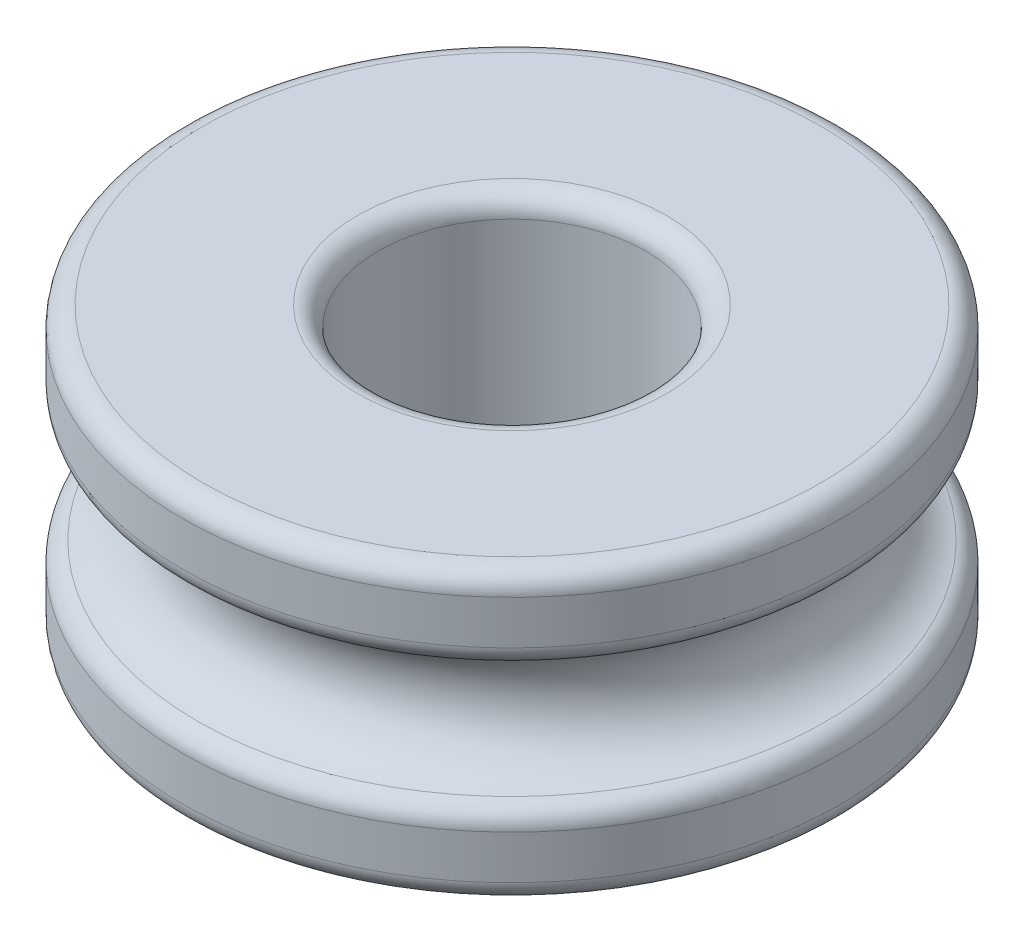
ISO-10303-21;
HEADER;
FILE_DESCRIPTION(('STEP AP214'),'2;1');
FILE_NAME('part.step','',(''),(''),'','','');
FILE_SCHEMA(('AUTOMOTIVE_DESIGN { 1 0 10303 214 1 1 1 1 }'));
ENDSEC;
DATA;
#1=APPLICATION_CONTEXT('core data for automotive mechanical design processes');
#2=APPLICATION_PROTOCOL_DEFINITION('international standard','automotive_design',2000,#1);
#3=PRODUCT_CONTEXT('',#1,'mechanical');
#4=PRODUCT('Part','Part','',(#3));
#5=PRODUCT_RELATED_PRODUCT_CATEGORY('part','',(#4));
#6=PRODUCT_DEFINITION_FORMATION('','',#4);
#7=PRODUCT_DEFINITION_CONTEXT('part definition',#1,'design');
#8=PRODUCT_DEFINITION('design','',#6,#7);
#9=PRODUCT_DEFINITION_SHAPE('','',#8);
#10=(LENGTH_UNIT() NAMED_UNIT(*) SI_UNIT(.MILLI.,.METRE.));
#11=(NAMED_UNIT(*) PLANE_ANGLE_UNIT() SI_UNIT($,.RADIAN.));
#12=(NAMED_UNIT(*) SI_UNIT($,.STERADIAN.) SOLID_ANGLE_UNIT());
#13=UNCERTAINTY_MEASURE_WITH_UNIT(LENGTH_MEASURE(1.E-05),#10,'distance_accuracy_value','');
#14=(GEOMETRIC_REPRESENTATION_CONTEXT(3) GLOBAL_UNCERTAINTY_ASSIGNED_CONTEXT((#13)) GLOBAL_UNIT_ASSIGNED_CONTEXT((#10,
#11,#12)) REPRESENTATION_CONTEXT('',''));
#15=CARTESIAN_POINT('',(0.,0.,0.));
#16=DIRECTION('',(0.,0.,1.));
#17=DIRECTION('',(1.,0.,0.));
#18=AXIS2_PLACEMENT_3D('',#15,#16,#17);
#19=CARTESIAN_POINT('',(-1.625,0.,0.));
#20=DIRECTION('',(0.,-1.,0.));
#21=DIRECTION('',(0.,0.,-1.));
#22=AXIS2_PLACEMENT_3D('',#19,#20,#21);
#23=TOROIDAL_SURFACE('',#22,8.,1.5);
#24=CARTESIAN_POINT('',(-1.625,1.45236875482774,0.));
#25=DIRECTION('',(0.,-1.,0.));
#26=DIRECTION('',(0.,0.,-1.));
#27=AXIS2_PLACEMENT_3D('',#24,#25,#26);
#28=CIRCLE('',#27,7.62500000000001);
#29=CARTESIAN_POINT('',(-1.625,1.45236875482774,-7.62500000000001));
#30=VERTEX_POINT('',#29);
#31=EDGE_CURVE('E71',#30,#30,#28,.T.);
#32=ORIENTED_EDGE('',*,*,#31,.T.);
#33=EDGE_LOOP('',(#32));
#34=FACE_BOUND('',#33,.T.);
#35=CARTESIAN_POINT('',(-1.625,-1.45236875482774,0.));
#36=DIRECTION('',(0.,1.,0.));
#37=DIRECTION('',(0.,0.,1.));
#38=AXIS2_PLACEMENT_3D('',#35,#36,#37);
#39=CIRCLE('',#38,7.62500000000001);
#40=CARTESIAN_POINT('',(-1.625,-1.45236875482774,7.62500000000001));
#41=VERTEX_POINT('',#40);
#42=EDGE_CURVE('E74',#41,#41,#39,.T.);
#43=ORIENTED_EDGE('',*,*,#42,.T.);
#44=EDGE_LOOP('',(#43));
#45=FACE_BOUND('',#44,.T.);
#46=ADVANCED_FACE('F33',(#34,#45),#23,.F.);
#47=CARTESIAN_POINT('',(-1.625,-3.5,0.));
#48=DIRECTION('',(0.,-1.,0.));
#49=DIRECTION('',(0.,0.,-1.));
#50=AXIS2_PLACEMENT_3D('',#47,#48,#49);
#51=CYLINDRICAL_SURFACE('',#50,8.);
#52=CARTESIAN_POINT('',(-1.625,1.93649167310371,0.));
#53=DIRECTION('',(0.,1.,0.));
#54=DIRECTION('',(0.,0.,1.));
#55=AXIS2_PLACEMENT_3D('',#52,#53,#54);
#56=CIRCLE('',#55,8.);
#57=CARTESIAN_POINT('',(-1.625,1.93649167310371,8.));
#58=VERTEX_POINT('',#57);
#59=EDGE_CURVE('E65',#58,#58,#56,.T.);
#60=ORIENTED_EDGE('',*,*,#59,.T.);
#61=EDGE_LOOP('',(#60));
#62=FACE_BOUND('',#61,.T.);
#63=CARTESIAN_POINT('',(-1.625,3.,0.));
#64=DIRECTION('',(0.,-1.,0.));
#65=DIRECTION('',(0.,0.,-1.));
#66=AXIS2_PLACEMENT_3D('',#63,#64,#65);
#67=CIRCLE('',#66,8.);
#68=CARTESIAN_POINT('',(-1.625,3.,-8.));
#69=VERTEX_POINT('',#68);
#70=EDGE_CURVE('E68',#69,#69,#67,.T.);
#71=ORIENTED_EDGE('',*,*,#70,.T.);
#72=EDGE_LOOP('',(#71));
#73=FACE_BOUND('',#72,.T.);
#74=ADVANCED_FACE('F101',(#62,#73),#51,.T.);
#75=CARTESIAN_POINT('',(0.,3.5,0.));
#76=DIRECTION('',(0.,-1.,0.));
#77=DIRECTION('',(0.,0.,-1.));
#78=AXIS2_PLACEMENT_3D('',#75,#76,#77);
#79=PLANE('',#78);
#80=CARTESIAN_POINT('',(-1.625,3.5,0.));
#81=DIRECTION('',(0.,-1.,0.));
#82=DIRECTION('',(0.,0.,-1.));
#83=AXIS2_PLACEMENT_3D('',#80,#81,#82);
#84=CIRCLE('',#83,3.75);
#85=CARTESIAN_POINT('',(-1.625,3.5,-3.75));
#86=VERTEX_POINT('',#85);
#87=EDGE_CURVE('E10',#86,#86,#84,.T.);
#88=ORIENTED_EDGE('',*,*,#87,.T.);
#89=EDGE_LOOP('',(#88));
#90=FACE_BOUND('',#89,.T.);
#91=CARTESIAN_POINT('',(-1.625,3.5,0.));
#92=DIRECTION('',(0.,-1.,0.));
#93=DIRECTION('',(0.,0.,-1.));
#94=AXIS2_PLACEMENT_3D('',#91,#92,#93);
#95=CIRCLE('',#94,7.5);
#96=CARTESIAN_POINT('',(-1.625,3.5,-7.5));
#97=VERTEX_POINT('',#96);
#98=EDGE_CURVE('E40',#97,#97,#95,.F.);
#99=ORIENTED_EDGE('',*,*,#98,.T.);
#100=EDGE_LOOP('',(#99));
#101=FACE_BOUND('',#100,.T.);
#102=ADVANCED_FACE('F107',(#90,#101),#79,.F.);
#103=CARTESIAN_POINT('',(-1.625,-3.5,0.));
#104=DIRECTION('',(0.,-1.,0.));
#105=DIRECTION('',(0.,0.,-1.));
#106=AXIS2_PLACEMENT_3D('',#103,#104,#105);
#107=CYLINDRICAL_SURFACE('',#106,3.25);
#108=CARTESIAN_POINT('',(-1.625,-3.,0.));
#109=DIRECTION('',(0.,-1.,0.));
#110=DIRECTION('',(0.,0.,-1.));
#111=AXIS2_PLACEMENT_3D('',#108,#109,#110);
#112=CIRCLE('',#111,3.25);
#113=CARTESIAN_POINT('',(-1.625,-3.,-3.25));
#114=VERTEX_POINT('',#113);
#115=EDGE_CURVE('E59',#114,#114,#112,.T.);
#116=ORIENTED_EDGE('',*,*,#115,.T.);
#117=EDGE_LOOP('',(#116));
#118=FACE_BOUND('',#117,.T.);
#119=CARTESIAN_POINT('',(-1.625,3.,0.));
#120=DIRECTION('',(0.,-1.,0.));
#121=DIRECTION('',(0.,0.,-1.));
#122=AXIS2_PLACEMENT_3D('',#119,#120,#121);
#123=CIRCLE('',#122,3.25);
#124=CARTESIAN_POINT('',(-1.625,3.,-3.25));
#125=VERTEX_POINT('',#124);
#126=EDGE_CURVE('E62',#125,#125,#123,.F.);
#127=ORIENTED_EDGE('',*,*,#126,.T.);
#128=EDGE_LOOP('',(#127));
#129=FACE_BOUND('',#128,.T.);
#130=ADVANCED_FACE('F97',(#118,#129),#107,.F.);
#131=CARTESIAN_POINT('',(0.,-3.5,0.));
#132=DIRECTION('',(0.,-1.,0.));
#133=DIRECTION('',(0.,0.,-1.));
#134=AXIS2_PLACEMENT_3D('',#131,#132,#133);
#135=PLANE('',#134);
#136=CARTESIAN_POINT('',(-1.625,-3.5,0.));
#137=DIRECTION('',(0.,-1.,0.));
#138=DIRECTION('',(0.,0.,-1.));
#139=AXIS2_PLACEMENT_3D('',#136,#137,#138);
#140=CIRCLE('',#139,3.75);
#141=CARTESIAN_POINT('',(-1.625,-3.5,-3.75));
#142=VERTEX_POINT('',#141);
#143=EDGE_CURVE('E53',#142,#142,#140,.F.);
#144=ORIENTED_EDGE('',*,*,#143,.T.);
#145=EDGE_LOOP('',(#144));
#146=FACE_BOUND('',#145,.T.);
#147=CARTESIAN_POINT('',(-1.625,-3.5,0.));
#148=DIRECTION('',(0.,-1.,0.));
#149=DIRECTION('',(0.,0.,-1.));
#150=AXIS2_PLACEMENT_3D('',#147,#148,#149);
#151=CIRCLE('',#150,7.5);
#152=CARTESIAN_POINT('',(-1.625,-3.5,-7.5));
#153=VERTEX_POINT('',#152);
#154=EDGE_CURVE('E56',#153,#153,#151,.T.);
#155=ORIENTED_EDGE('',*,*,#154,.T.);
#156=EDGE_LOOP('',(#155));
#157=FACE_BOUND('',#156,.T.);
#158=ADVANCED_FACE('F87',(#146,#157),#135,.T.);
#159=CARTESIAN_POINT('',(-1.625,-3.5,0.));
#160=DIRECTION('',(0.,-1.,0.));
#161=DIRECTION('',(0.,0.,-1.));
#162=AXIS2_PLACEMENT_3D('',#159,#160,#161);
#163=CYLINDRICAL_SURFACE('',#162,8.);
#164=CARTESIAN_POINT('',(-1.625,-3.,0.));
#165=DIRECTION('',(0.,-1.,0.));
#166=DIRECTION('',(0.,0.,-1.));
#167=AXIS2_PLACEMENT_3D('',#164,#165,#166);
#168=CIRCLE('',#167,8.);
#169=CARTESIAN_POINT('',(-1.625,-3.,-8.));
#170=VERTEX_POINT('',#169);
#171=EDGE_CURVE('E44',#170,#170,#168,.F.);
#172=ORIENTED_EDGE('',*,*,#171,.T.);
#173=EDGE_LOOP('',(#172));
#174=FACE_BOUND('',#173,.T.);
#175=CARTESIAN_POINT('',(-1.625,-1.93649167310371,0.));
#176=DIRECTION('',(0.,1.,0.));
#177=DIRECTION('',(0.,0.,1.));
#178=AXIS2_PLACEMENT_3D('',#175,#176,#177);
#179=CIRCLE('',#178,8.);
#180=CARTESIAN_POINT('',(-1.625,-1.93649167310371,8.));
#181=VERTEX_POINT('',#180);
#182=EDGE_CURVE('E48',#181,#181,#179,.F.);
#183=ORIENTED_EDGE('',*,*,#182,.T.);
#184=EDGE_LOOP('',(#183));
#185=FACE_BOUND('',#184,.T.);
#186=ADVANCED_FACE('F84',(#174,#185),#163,.T.);
#187=CARTESIAN_POINT('',(-1.625,1.93649167310371,0.));
#188=DIRECTION('',(0.,1.,0.));
#189=DIRECTION('',(0.,0.,1.));
#190=AXIS2_PLACEMENT_3D('',#187,#188,#189);
#191=TOROIDAL_SURFACE('',#190,7.5,0.5);
#192=ORIENTED_EDGE('',*,*,#59,.F.);
#193=EDGE_LOOP('',(#192));
#194=FACE_BOUND('',#193,.T.);
#195=ORIENTED_EDGE('',*,*,#31,.F.);
#196=EDGE_LOOP('',(#195));
#197=FACE_BOUND('',#196,.T.);
#198=ADVANCED_FACE('F86',(#194,#197),#191,.T.);
#199=CARTESIAN_POINT('',(-1.625,-3.,0.));
#200=DIRECTION('',(0.,-1.,0.));
#201=DIRECTION('',(0.,0.,-1.));
#202=AXIS2_PLACEMENT_3D('',#199,#200,#201);
#203=TOROIDAL_SURFACE('',#202,3.75,0.5);
#204=ORIENTED_EDGE('',*,*,#143,.F.);
#205=EDGE_LOOP('',(#204));
#206=FACE_BOUND('',#205,.T.);
#207=ORIENTED_EDGE('',*,*,#115,.F.);
#208=EDGE_LOOP('',(#207));
#209=FACE_BOUND('',#208,.T.);
#210=ADVANCED_FACE('F94',(#206,#209),#203,.T.);
#211=CARTESIAN_POINT('',(-1.625,-3.,0.));
#212=DIRECTION('',(0.,-1.,0.));
#213=DIRECTION('',(0.,0.,-1.));
#214=AXIS2_PLACEMENT_3D('',#211,#212,#213);
#215=TOROIDAL_SURFACE('',#214,7.5,0.5);
#216=ORIENTED_EDGE('',*,*,#171,.F.);
#217=EDGE_LOOP('',(#216));
#218=FACE_BOUND('',#217,.T.);
#219=ORIENTED_EDGE('',*,*,#154,.F.);
#220=EDGE_LOOP('',(#219));
#221=FACE_BOUND('',#220,.T.);
#222=ADVANCED_FACE('F114',(#218,#221),#215,.T.);
#223=CARTESIAN_POINT('',(-1.625,3.,0.));
#224=DIRECTION('',(0.,-1.,0.));
#225=DIRECTION('',(0.,0.,-1.));
#226=AXIS2_PLACEMENT_3D('',#223,#224,#225);
#227=TOROIDAL_SURFACE('',#226,3.75,0.5);
#228=ORIENTED_EDGE('',*,*,#126,.F.);
#229=EDGE_LOOP('',(#228));
#230=FACE_BOUND('',#229,.T.);
#231=ORIENTED_EDGE('',*,*,#87,.F.);
#232=EDGE_LOOP('',(#231));
#233=FACE_BOUND('',#232,.T.);
#234=ADVANCED_FACE('F118',(#230,#233),#227,.T.);
#235=CARTESIAN_POINT('',(-1.625,3.,0.));
#236=DIRECTION('',(0.,-1.,0.));
#237=DIRECTION('',(0.,0.,-1.));
#238=AXIS2_PLACEMENT_3D('',#235,#236,#237);
#239=TOROIDAL_SURFACE('',#238,7.5,0.5);
#240=ORIENTED_EDGE('',*,*,#98,.F.);
#241=EDGE_LOOP('',(#240));
#242=FACE_BOUND('',#241,.T.);
#243=ORIENTED_EDGE('',*,*,#70,.F.);
#244=EDGE_LOOP('',(#243));
#245=FACE_BOUND('',#244,.T.);
#246=ADVANCED_FACE('F81',(#242,#245),#239,.T.);
#247=CARTESIAN_POINT('',(-1.625,-1.93649167310371,0.));
#248=DIRECTION('',(0.,1.,0.));
#249=DIRECTION('',(0.,0.,1.));
#250=AXIS2_PLACEMENT_3D('',#247,#248,#249);
#251=TOROIDAL_SURFACE('',#250,7.5,0.5);
#252=ORIENTED_EDGE('',*,*,#42,.F.);
#253=EDGE_LOOP('',(#252));
#254=FACE_BOUND('',#253,.T.);
#255=ORIENTED_EDGE('',*,*,#182,.F.);
#256=EDGE_LOOP('',(#255));
#257=FACE_BOUND('',#256,.T.);
#258=ADVANCED_FACE('F35',(#254,#257),#251,.T.);
#259=CLOSED_SHELL('',(#46,#74,#102,#130,#158,#186,#198,#210,#222,#234,#246,#258));
#260=MANIFOLD_SOLID_BREP('B2',#259);
#261=ADVANCED_BREP_SHAPE_REPRESENTATION('',(#18,#260),#14);
#262=SHAPE_DEFINITION_REPRESENTATION(#9,#261);
ENDSEC;
END-ISO-10303-21;
